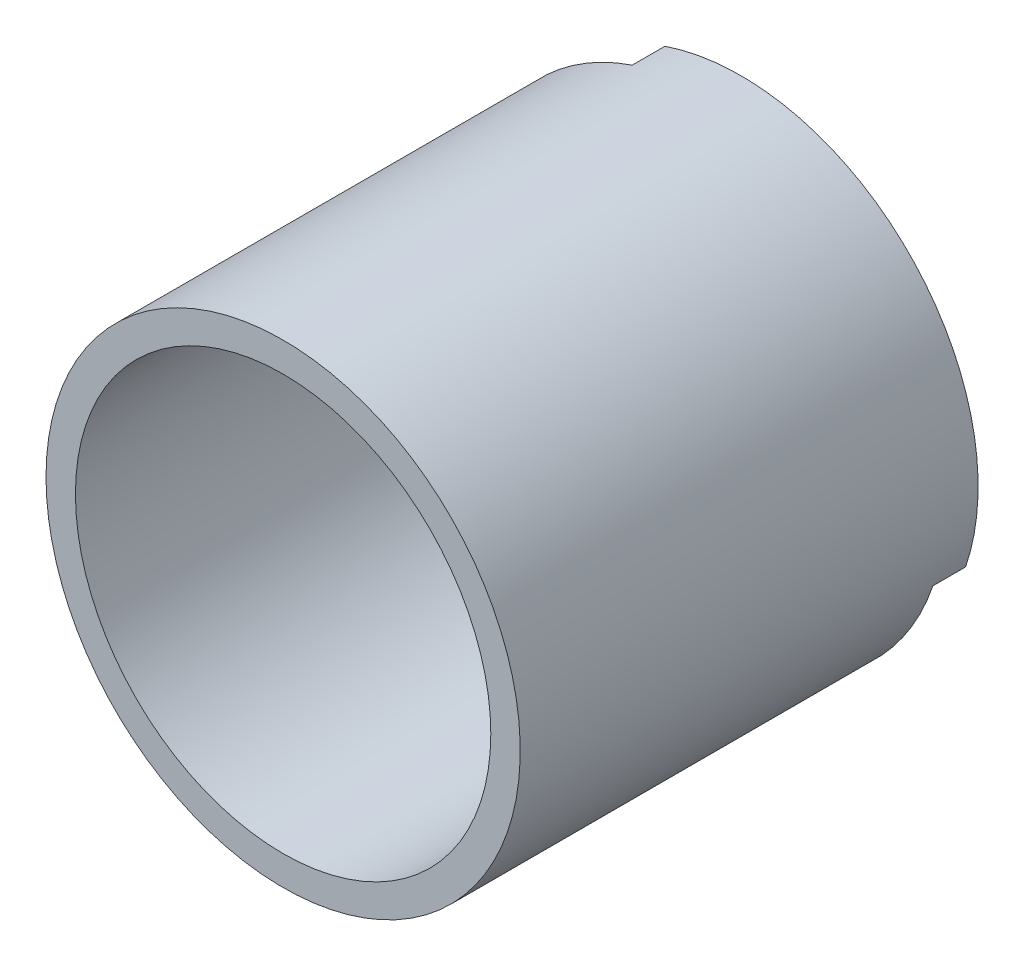
ISO-10303-21;
HEADER;
FILE_DESCRIPTION(('STEP AP214'),'2;1');
FILE_NAME('part.step','',(''),(''),'','','');
FILE_SCHEMA(('AUTOMOTIVE_DESIGN { 1 0 10303 214 1 1 1 1 }'));
ENDSEC;
DATA;
#1=APPLICATION_CONTEXT('core data for automotive mechanical design processes');
#2=APPLICATION_PROTOCOL_DEFINITION('international standard','automotive_design',2000,#1);
#3=PRODUCT_CONTEXT('',#1,'mechanical');
#4=PRODUCT('Part','Part','',(#3));
#5=PRODUCT_RELATED_PRODUCT_CATEGORY('part','',(#4));
#6=PRODUCT_DEFINITION_FORMATION('','',#4);
#7=PRODUCT_DEFINITION_CONTEXT('part definition',#1,'design');
#8=PRODUCT_DEFINITION('design','',#6,#7);
#9=PRODUCT_DEFINITION_SHAPE('','',#8);
#10=(LENGTH_UNIT() NAMED_UNIT(*) SI_UNIT(.MILLI.,.METRE.));
#11=(NAMED_UNIT(*) PLANE_ANGLE_UNIT() SI_UNIT($,.RADIAN.));
#12=(NAMED_UNIT(*) SI_UNIT($,.STERADIAN.) SOLID_ANGLE_UNIT());
#13=UNCERTAINTY_MEASURE_WITH_UNIT(LENGTH_MEASURE(1.E-05),#10,'distance_accuracy_value','');
#14=(GEOMETRIC_REPRESENTATION_CONTEXT(3) GLOBAL_UNCERTAINTY_ASSIGNED_CONTEXT((#13)) GLOBAL_UNIT_ASSIGNED_CONTEXT((#10,
#11,#12)) REPRESENTATION_CONTEXT('',''));
#15=CARTESIAN_POINT('',(0.,0.,0.));
#16=DIRECTION('',(0.,0.,1.));
#17=DIRECTION('',(1.,0.,0.));
#18=AXIS2_PLACEMENT_3D('',#15,#16,#17);
#19=CARTESIAN_POINT('',(0.,0.,35.56));
#20=DIRECTION('',(0.,0.,-1.));
#21=DIRECTION('',(-1.,0.,0.));
#22=AXIS2_PLACEMENT_3D('',#19,#20,#21);
#23=CYLINDRICAL_SURFACE('',#22,16.129);
#24=CARTESIAN_POINT('',(0.,0.,0.));
#25=DIRECTION('',(0.,0.,-1.));
#26=DIRECTION('',(-1.,0.,0.));
#27=AXIS2_PLACEMENT_3D('',#24,#25,#26);
#28=CIRCLE('',#27,16.129);
#29=CARTESIAN_POINT('',(-16.129,0.,0.));
#30=VERTEX_POINT('',#29);
#31=EDGE_CURVE('E80',#30,#30,#28,.T.);
#32=ORIENTED_EDGE('',*,*,#31,.T.);
#33=EDGE_LOOP('',(#32));
#34=FACE_BOUND('',#33,.T.);
#35=CARTESIAN_POINT('',(0.,0.,35.56));
#36=DIRECTION('',(0.,0.,-1.));
#37=DIRECTION('',(-1.,0.,0.));
#38=AXIS2_PLACEMENT_3D('',#35,#36,#37);
#39=CIRCLE('',#38,16.129);
#40=CARTESIAN_POINT('',(-16.129,0.,35.56));
#41=VERTEX_POINT('',#40);
#42=EDGE_CURVE('E20',#41,#41,#39,.T.);
#43=ORIENTED_EDGE('',*,*,#42,.F.);
#44=EDGE_LOOP('',(#43));
#45=FACE_BOUND('',#44,.T.);
#46=ADVANCED_FACE('F17',(#34,#45),#23,.F.);
#47=CARTESIAN_POINT('',(4.93914086658836,-18.4095250481917,2.54));
#48=DIRECTION('',(0.,0.,1.));
#49=DIRECTION('',(1.,0.,0.));
#50=AXIS2_PLACEMENT_3D('',#47,#48,#49);
#51=PLANE('',#50);
#52=CARTESIAN_POINT('',(0.,0.,2.54));
#53=DIRECTION('',(0.,0.,-1.));
#54=DIRECTION('',(-1.,0.,0.));
#55=AXIS2_PLACEMENT_3D('',#52,#53,#54);
#56=CIRCLE('',#55,18.415);
#57=CARTESIAN_POINT('',(5.90665903283448,-17.4420068819455,2.54));
#58=VERTEX_POINT('',#57);
#59=CARTESIAN_POINT('',(17.4420068819457,-5.90665903283387,2.54));
#60=VERTEX_POINT('',#59);
#61=EDGE_CURVE('E58',#58,#60,#56,.F.);
#62=ORIENTED_EDGE('',*,*,#61,.F.);
#63=DIRECTION('',(0.707106781186535,0.70710678118656,0.));
#64=VECTOR('',#63,1.);
#65=CARTESIAN_POINT('',(18.4095250481918,-4.93914086658772,2.54));
#66=LINE('',#65,#64);
#67=EDGE_CURVE('E54',#60,#58,#66,.F.);
#68=ORIENTED_EDGE('',*,*,#67,.F.);
#69=EDGE_LOOP('',(#62,#68));
#70=FACE_BOUND('',#69,.T.);
#71=ADVANCED_FACE('F56',(#70),#51,.F.);
#72=CARTESIAN_POINT('',(18.4095250481918,-4.93914086658772,2.54));
#73=DIRECTION('',(0.70710678118656,-0.707106781186535,0.));
#74=DIRECTION('',(0.707106781186535,0.70710678118656,0.));
#75=AXIS2_PLACEMENT_3D('',#72,#73,#74);
#76=PLANE('',#75);
#77=DIRECTION('',(0.,0.,-1.));
#78=VECTOR('',#77,1.);
#79=CARTESIAN_POINT('',(17.4420068819457,-5.90665903283387,35.56));
#80=LINE('',#79,#78);
#81=CARTESIAN_POINT('',(17.4420068819457,-5.90665903283387,0.));
#82=VERTEX_POINT('',#81);
#83=EDGE_CURVE('E65',#60,#82,#80,.T.);
#84=ORIENTED_EDGE('',*,*,#83,.F.);
#85=ORIENTED_EDGE('',*,*,#67,.T.);
#86=DIRECTION('',(0.,0.,-1.));
#87=VECTOR('',#86,1.);
#88=CARTESIAN_POINT('',(5.9066590328345,-17.4420068819455,35.56));
#89=LINE('',#88,#87);
#90=CARTESIAN_POINT('',(5.90665903283449,-17.4420068819455,0.));
#91=VERTEX_POINT('',#90);
#92=EDGE_CURVE('E75',#91,#58,#89,.F.);
#93=ORIENTED_EDGE('',*,*,#92,.F.);
#94=DIRECTION('',(0.707106781186535,0.70710678118656,0.));
#95=VECTOR('',#94,1.);
#96=CARTESIAN_POINT('',(5.90665903283448,-17.4420068819455,0.));
#97=LINE('',#96,#95);
#98=EDGE_CURVE('E68',#91,#82,#97,.T.);
#99=ORIENTED_EDGE('',*,*,#98,.T.);
#100=EDGE_LOOP('',(#84,#85,#93,#99));
#101=FACE_BOUND('',#100,.T.);
#102=ADVANCED_FACE('F66',(#101),#76,.T.);
#103=CARTESIAN_POINT('',(0.,-40.6544213562373,35.56));
#104=DIRECTION('',(0.,0.,1.));
#105=DIRECTION('',(1.,0.,0.));
#106=AXIS2_PLACEMENT_3D('',#103,#104,#105);
#107=PLANE('',#106);
#108=CARTESIAN_POINT('',(0.,0.,35.56));
#109=DIRECTION('',(0.,0.,-1.));
#110=DIRECTION('',(-1.,0.,0.));
#111=AXIS2_PLACEMENT_3D('',#108,#109,#110);
#112=CIRCLE('',#111,18.415);
#113=CARTESIAN_POINT('',(-18.415,0.,35.56));
#114=VERTEX_POINT('',#113);
#115=EDGE_CURVE('E71',#114,#114,#112,.T.);
#116=ORIENTED_EDGE('',*,*,#115,.F.);
#117=EDGE_LOOP('',(#116));
#118=FACE_BOUND('',#117,.T.);
#119=ORIENTED_EDGE('',*,*,#42,.T.);
#120=EDGE_LOOP('',(#119));
#121=FACE_BOUND('',#120,.T.);
#122=ADVANCED_FACE('F100',(#118,#121),#107,.T.);
#123=CARTESIAN_POINT('',(-18.4095250481918,4.93914086658804,2.54));
#124=DIRECTION('',(0.,0.,-1.));
#125=DIRECTION('',(-1.,0.,0.));
#126=AXIS2_PLACEMENT_3D('',#123,#124,#125);
#127=PLANE('',#126);
#128=CARTESIAN_POINT('',(0.,0.,2.54));
#129=DIRECTION('',(0.,0.,-1.));
#130=DIRECTION('',(-1.,0.,0.));
#131=AXIS2_PLACEMENT_3D('',#128,#129,#130);
#132=CIRCLE('',#131,18.415);
#133=CARTESIAN_POINT('',(-5.90665903283419,17.4420068819456,2.54));
#134=VERTEX_POINT('',#133);
#135=CARTESIAN_POINT('',(-17.4420068819456,5.90665903283417,2.54));
#136=VERTEX_POINT('',#135);
#137=EDGE_CURVE('E93',#134,#136,#132,.F.);
#138=ORIENTED_EDGE('',*,*,#137,.F.);
#139=DIRECTION('',(-0.707106781186547,-0.707106781186548,0.));
#140=VECTOR('',#139,1.);
#141=CARTESIAN_POINT('',(-4.93914086658804,18.4095250481918,2.54));
#142=LINE('',#141,#140);
#143=EDGE_CURVE('E82',#136,#134,#142,.F.);
#144=ORIENTED_EDGE('',*,*,#143,.F.);
#145=EDGE_LOOP('',(#138,#144));
#146=FACE_BOUND('',#145,.T.);
#147=ADVANCED_FACE('F103',(#146),#127,.T.);
#148=CARTESIAN_POINT('',(-4.93914086658804,18.4095250481918,2.54));
#149=DIRECTION('',(-0.707106781186548,0.707106781186547,0.));
#150=DIRECTION('',(-0.707106781186547,-0.707106781186548,0.));
#151=AXIS2_PLACEMENT_3D('',#148,#149,#150);
#152=PLANE('',#151);
#153=DIRECTION('',(0.,0.,-1.));
#154=VECTOR('',#153,1.);
#155=CARTESIAN_POINT('',(-17.4420068819456,5.90665903283417,35.56));
#156=LINE('',#155,#154);
#157=CARTESIAN_POINT('',(-17.4420068819456,5.90665903283417,0.));
#158=VERTEX_POINT('',#157);
#159=EDGE_CURVE('E26',#136,#158,#156,.T.);
#160=ORIENTED_EDGE('',*,*,#159,.F.);
#161=ORIENTED_EDGE('',*,*,#143,.T.);
#162=DIRECTION('',(0.,0.,-1.));
#163=VECTOR('',#162,1.);
#164=CARTESIAN_POINT('',(-5.9066590328342,17.4420068819456,35.56));
#165=LINE('',#164,#163);
#166=CARTESIAN_POINT('',(-5.9066590328342,17.4420068819456,0.));
#167=VERTEX_POINT('',#166);
#168=EDGE_CURVE('E91',#167,#134,#165,.F.);
#169=ORIENTED_EDGE('',*,*,#168,.F.);
#170=DIRECTION('',(-0.707106781186547,-0.707106781186548,0.));
#171=VECTOR('',#170,1.);
#172=CARTESIAN_POINT('',(-5.9066590328342,17.4420068819456,0.));
#173=LINE('',#172,#171);
#174=EDGE_CURVE('E35',#167,#158,#173,.T.);
#175=ORIENTED_EDGE('',*,*,#174,.T.);
#176=EDGE_LOOP('',(#160,#161,#169,#175));
#177=FACE_BOUND('',#176,.T.);
#178=ADVANCED_FACE('F118',(#177),#152,.T.);
#179=CARTESIAN_POINT('',(0.,-40.6544213562373,0.));
#180=DIRECTION('',(0.,0.,1.));
#181=DIRECTION('',(1.,0.,0.));
#182=AXIS2_PLACEMENT_3D('',#179,#180,#181);
#183=PLANE('',#182);
#184=ORIENTED_EDGE('',*,*,#98,.F.);
#185=CARTESIAN_POINT('',(0.,0.,0.));
#186=DIRECTION('',(0.,0.,-1.));
#187=DIRECTION('',(-1.,0.,0.));
#188=AXIS2_PLACEMENT_3D('',#185,#186,#187);
#189=CIRCLE('',#188,18.415);
#190=EDGE_CURVE('E11',#158,#91,#189,.F.);
#191=ORIENTED_EDGE('',*,*,#190,.F.);
#192=ORIENTED_EDGE('',*,*,#174,.F.);
#193=CARTESIAN_POINT('',(0.,0.,0.));
#194=DIRECTION('',(0.,0.,-1.));
#195=DIRECTION('',(-1.,0.,0.));
#196=AXIS2_PLACEMENT_3D('',#193,#194,#195);
#197=CIRCLE('',#196,18.415);
#198=EDGE_CURVE('E94',#82,#167,#197,.F.);
#199=ORIENTED_EDGE('',*,*,#198,.F.);
#200=EDGE_LOOP('',(#184,#191,#192,#199));
#201=FACE_BOUND('',#200,.T.);
#202=ORIENTED_EDGE('',*,*,#31,.F.);
#203=EDGE_LOOP('',(#202));
#204=FACE_BOUND('',#203,.T.);
#205=ADVANCED_FACE('F113',(#201,#204),#183,.F.);
#206=CARTESIAN_POINT('',(0.,0.,35.56));
#207=DIRECTION('',(0.,0.,-1.));
#208=DIRECTION('',(-1.,0.,0.));
#209=AXIS2_PLACEMENT_3D('',#206,#207,#208);
#210=CYLINDRICAL_SURFACE('',#209,18.415);
#211=ORIENTED_EDGE('',*,*,#83,.T.);
#212=ORIENTED_EDGE('',*,*,#198,.T.);
#213=ORIENTED_EDGE('',*,*,#168,.T.);
#214=ORIENTED_EDGE('',*,*,#137,.T.);
#215=ORIENTED_EDGE('',*,*,#159,.T.);
#216=ORIENTED_EDGE('',*,*,#190,.T.);
#217=ORIENTED_EDGE('',*,*,#92,.T.);
#218=ORIENTED_EDGE('',*,*,#61,.T.);
#219=EDGE_LOOP('',(#211,#212,#213,#214,#215,#216,#217,#218));
#220=FACE_BOUND('',#219,.T.);
#221=ORIENTED_EDGE('',*,*,#115,.T.);
#222=EDGE_LOOP('',(#221));
#223=FACE_BOUND('',#222,.T.);
#224=ADVANCED_FACE('F73',(#220,#223),#210,.T.);
#225=CLOSED_SHELL('',(#46,#71,#102,#122,#147,#178,#205,#224));
#226=MANIFOLD_SOLID_BREP('B1',#225);
#227=ADVANCED_BREP_SHAPE_REPRESENTATION('',(#18,#226),#14);
#228=SHAPE_DEFINITION_REPRESENTATION(#9,#227);
ENDSEC;
END-ISO-10303-21;
